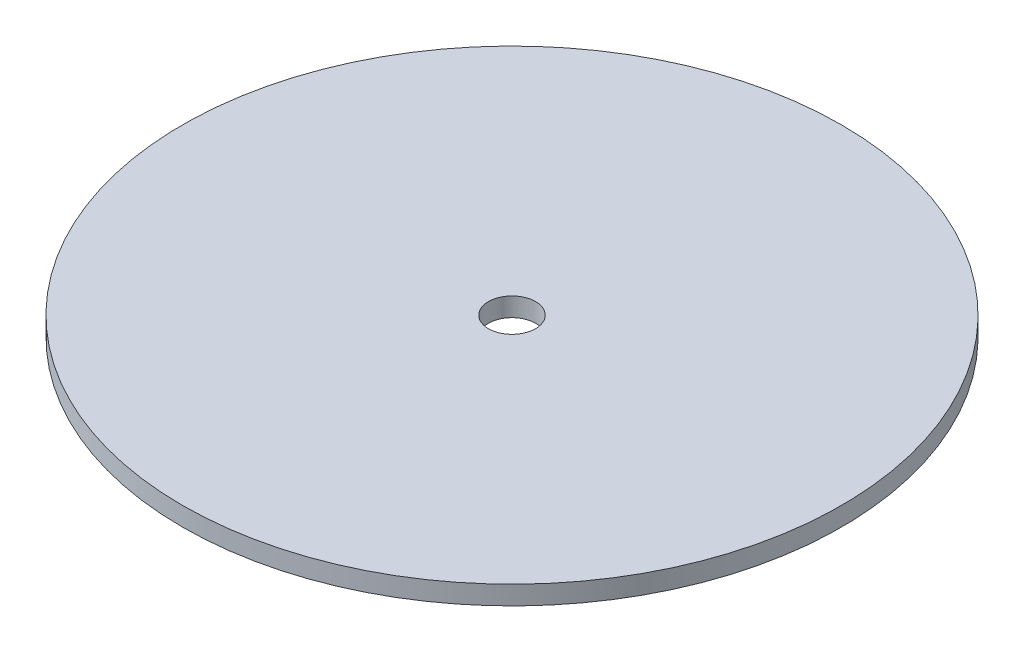
ISO-10303-21;
HEADER;
FILE_DESCRIPTION(('STEP AP214'),'2;1');
FILE_NAME('part.step','',(''),(''),'','','');
FILE_SCHEMA(('AUTOMOTIVE_DESIGN { 1 0 10303 214 1 1 1 1 }'));
ENDSEC;
DATA;
#1=APPLICATION_CONTEXT('core data for automotive mechanical design processes');
#2=APPLICATION_PROTOCOL_DEFINITION('international standard','automotive_design',2000,#1);
#3=PRODUCT_CONTEXT('',#1,'mechanical');
#4=PRODUCT('Part','Part','',(#3));
#5=PRODUCT_RELATED_PRODUCT_CATEGORY('part','',(#4));
#6=PRODUCT_DEFINITION_FORMATION('','',#4);
#7=PRODUCT_DEFINITION_CONTEXT('part definition',#1,'design');
#8=PRODUCT_DEFINITION('design','',#6,#7);
#9=PRODUCT_DEFINITION_SHAPE('','',#8);
#10=(LENGTH_UNIT() NAMED_UNIT(*) SI_UNIT(.MILLI.,.METRE.));
#11=(NAMED_UNIT(*) PLANE_ANGLE_UNIT() SI_UNIT($,.RADIAN.));
#12=(NAMED_UNIT(*) SI_UNIT($,.STERADIAN.) SOLID_ANGLE_UNIT());
#13=UNCERTAINTY_MEASURE_WITH_UNIT(LENGTH_MEASURE(1.E-05),#10,'distance_accuracy_value','');
#14=(GEOMETRIC_REPRESENTATION_CONTEXT(3) GLOBAL_UNCERTAINTY_ASSIGNED_CONTEXT((#13)) GLOBAL_UNIT_ASSIGNED_CONTEXT((#10,
#11,#12)) REPRESENTATION_CONTEXT('',''));
#15=CARTESIAN_POINT('',(0.,0.,0.));
#16=DIRECTION('',(0.,0.,1.));
#17=DIRECTION('',(1.,0.,0.));
#18=AXIS2_PLACEMENT_3D('',#15,#16,#17);
#19=CARTESIAN_POINT('',(0.,8.,0.));
#20=DIRECTION('',(0.,1.,0.));
#21=DIRECTION('',(0.,0.,1.));
#22=AXIS2_PLACEMENT_3D('',#19,#20,#21);
#23=PLANE('',#22);
#24=CARTESIAN_POINT('',(0.,8.,0.));
#25=DIRECTION('',(0.,1.,0.));
#26=DIRECTION('',(0.,0.,1.));
#27=AXIS2_PLACEMENT_3D('',#24,#25,#26);
#28=CIRCLE('',#27,140.);
#29=CARTESIAN_POINT('',(0.,8.,140.));
#30=VERTEX_POINT('',#29);
#31=EDGE_CURVE('E10',#30,#30,#28,.T.);
#32=ORIENTED_EDGE('',*,*,#31,.T.);
#33=EDGE_LOOP('',(#32));
#34=FACE_BOUND('',#33,.T.);
#35=CARTESIAN_POINT('',(0.,8.,0.));
#36=DIRECTION('',(0.,1.,0.));
#37=DIRECTION('',(0.,0.,1.));
#38=AXIS2_PLACEMENT_3D('',#35,#36,#37);
#39=CIRCLE('',#38,10.);
#40=CARTESIAN_POINT('',(0.,8.,10.));
#41=VERTEX_POINT('',#40);
#42=EDGE_CURVE('E42',#41,#41,#39,.T.);
#43=ORIENTED_EDGE('',*,*,#42,.F.);
#44=EDGE_LOOP('',(#43));
#45=FACE_BOUND('',#44,.T.);
#46=ADVANCED_FACE('F31',(#34,#45),#23,.T.);
#47=CARTESIAN_POINT('',(0.,0.,0.));
#48=DIRECTION('',(0.,1.,0.));
#49=DIRECTION('',(0.,0.,1.));
#50=AXIS2_PLACEMENT_3D('',#47,#48,#49);
#51=PLANE('',#50);
#52=CARTESIAN_POINT('',(0.,0.,0.));
#53=DIRECTION('',(0.,1.,0.));
#54=DIRECTION('',(0.,0.,1.));
#55=AXIS2_PLACEMENT_3D('',#52,#53,#54);
#56=CIRCLE('',#55,140.);
#57=CARTESIAN_POINT('',(0.,0.,140.));
#58=VERTEX_POINT('',#57);
#59=EDGE_CURVE('E35',#58,#58,#56,.T.);
#60=ORIENTED_EDGE('',*,*,#59,.F.);
#61=EDGE_LOOP('',(#60));
#62=FACE_BOUND('',#61,.T.);
#63=CARTESIAN_POINT('',(0.,0.,0.));
#64=DIRECTION('',(0.,1.,0.));
#65=DIRECTION('',(0.,0.,1.));
#66=AXIS2_PLACEMENT_3D('',#63,#64,#65);
#67=CIRCLE('',#66,10.);
#68=CARTESIAN_POINT('',(0.,0.,10.));
#69=VERTEX_POINT('',#68);
#70=EDGE_CURVE('E44',#69,#69,#67,.T.);
#71=ORIENTED_EDGE('',*,*,#70,.T.);
#72=EDGE_LOOP('',(#71));
#73=FACE_BOUND('',#72,.T.);
#74=ADVANCED_FACE('F54',(#62,#73),#51,.F.);
#75=CARTESIAN_POINT('',(0.,8.,0.));
#76=DIRECTION('',(0.,-1.,0.));
#77=DIRECTION('',(0.,0.,-1.));
#78=AXIS2_PLACEMENT_3D('',#75,#76,#77);
#79=CYLINDRICAL_SURFACE('',#78,140.);
#80=ORIENTED_EDGE('',*,*,#31,.F.);
#81=EDGE_LOOP('',(#80));
#82=FACE_BOUND('',#81,.T.);
#83=ORIENTED_EDGE('',*,*,#59,.T.);
#84=EDGE_LOOP('',(#83));
#85=FACE_BOUND('',#84,.T.);
#86=ADVANCED_FACE('F33',(#82,#85),#79,.T.);
#87=CARTESIAN_POINT('',(0.,8.,0.));
#88=DIRECTION('',(0.,-1.,0.));
#89=DIRECTION('',(0.,0.,-1.));
#90=AXIS2_PLACEMENT_3D('',#87,#88,#89);
#91=CYLINDRICAL_SURFACE('',#90,10.);
#92=ORIENTED_EDGE('',*,*,#42,.T.);
#93=EDGE_LOOP('',(#92));
#94=FACE_BOUND('',#93,.T.);
#95=ORIENTED_EDGE('',*,*,#70,.F.);
#96=EDGE_LOOP('',(#95));
#97=FACE_BOUND('',#96,.T.);
#98=ADVANCED_FACE('F50',(#94,#97),#91,.F.);
#99=CLOSED_SHELL('',(#46,#74,#86,#98));
#100=MANIFOLD_SOLID_BREP('B2',#99);
#101=ADVANCED_BREP_SHAPE_REPRESENTATION('',(#18,#100),#14);
#102=SHAPE_DEFINITION_REPRESENTATION(#9,#101);
ENDSEC;
END-ISO-10303-21;
